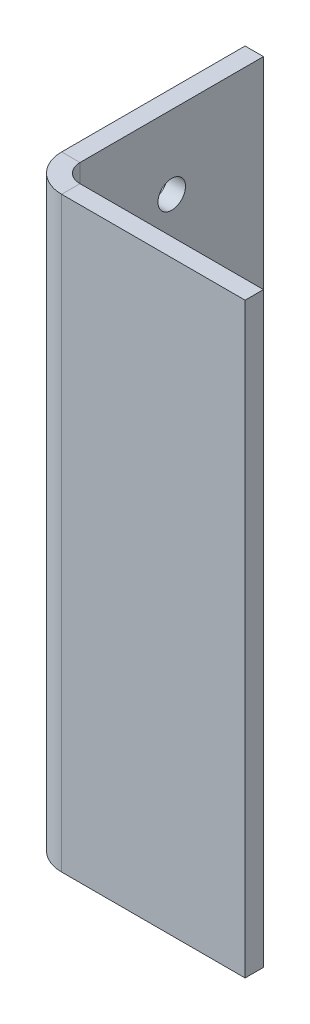
ISO-10303-21;
HEADER;
FILE_DESCRIPTION(('STEP AP214'),'2;1');
FILE_NAME('part.step','',(''),(''),'','','');
FILE_SCHEMA(('AUTOMOTIVE_DESIGN { 1 0 10303 214 1 1 1 1 }'));
ENDSEC;
DATA;
#1=APPLICATION_CONTEXT('core data for automotive mechanical design processes');
#2=APPLICATION_PROTOCOL_DEFINITION('international standard','automotive_design',2000,#1);
#3=PRODUCT_CONTEXT('',#1,'mechanical');
#4=PRODUCT('Part','Part','',(#3));
#5=PRODUCT_RELATED_PRODUCT_CATEGORY('part','',(#4));
#6=PRODUCT_DEFINITION_FORMATION('','',#4);
#7=PRODUCT_DEFINITION_CONTEXT('part definition',#1,'design');
#8=PRODUCT_DEFINITION('design','',#6,#7);
#9=PRODUCT_DEFINITION_SHAPE('','',#8);
#10=(LENGTH_UNIT() NAMED_UNIT(*) SI_UNIT(.MILLI.,.METRE.));
#11=(NAMED_UNIT(*) PLANE_ANGLE_UNIT() SI_UNIT($,.RADIAN.));
#12=(NAMED_UNIT(*) SI_UNIT($,.STERADIAN.) SOLID_ANGLE_UNIT());
#13=UNCERTAINTY_MEASURE_WITH_UNIT(LENGTH_MEASURE(1.E-05),#10,'distance_accuracy_value','');
#14=(GEOMETRIC_REPRESENTATION_CONTEXT(3) GLOBAL_UNCERTAINTY_ASSIGNED_CONTEXT((#13)) GLOBAL_UNIT_ASSIGNED_CONTEXT((#10,
#11,#12)) REPRESENTATION_CONTEXT('',''));
#15=CARTESIAN_POINT('',(0.,0.,0.));
#16=DIRECTION('',(0.,0.,1.));
#17=DIRECTION('',(1.,0.,0.));
#18=AXIS2_PLACEMENT_3D('',#15,#16,#17);
#19=CARTESIAN_POINT('',(0.,101.6,-6.35));
#20=DIRECTION('',(0.,1.,0.));
#21=DIRECTION('',(0.,0.,1.));
#22=AXIS2_PLACEMENT_3D('',#19,#20,#21);
#23=PLANE('',#22);
#24=DIRECTION('',(1.,0.,0.));
#25=VECTOR('',#24,1.);
#26=CARTESIAN_POINT('',(0.,101.6,-6.35));
#27=LINE('',#26,#25);
#28=CARTESIAN_POINT('',(0.,101.6,-6.35));
#29=VERTEX_POINT('',#28);
#30=CARTESIAN_POINT('',(3.175,101.6,-6.35));
#31=VERTEX_POINT('',#30);
#32=EDGE_CURVE('E11',#29,#31,#27,.T.);
#33=ORIENTED_EDGE('',*,*,#32,.F.);
#34=CARTESIAN_POINT('',(6.35,101.6,-6.35));
#35=DIRECTION('',(0.,-1.,0.));
#36=DIRECTION('',(0.,0.,-1.));
#37=AXIS2_PLACEMENT_3D('',#34,#35,#36);
#38=CIRCLE('',#37,6.35);
#39=CARTESIAN_POINT('',(6.35,101.6,0.));
#40=VERTEX_POINT('',#39);
#41=EDGE_CURVE('E128',#29,#40,#38,.F.);
#42=ORIENTED_EDGE('',*,*,#41,.T.);
#43=DIRECTION('',(0.,0.,1.));
#44=VECTOR('',#43,1.);
#45=CARTESIAN_POINT('',(6.35,101.6,-3.175));
#46=LINE('',#45,#44);
#47=CARTESIAN_POINT('',(6.35,101.6,-3.175));
#48=VERTEX_POINT('',#47);
#49=EDGE_CURVE('E46',#48,#40,#46,.T.);
#50=ORIENTED_EDGE('',*,*,#49,.F.);
#51=CARTESIAN_POINT('',(6.35,101.6,-6.35));
#52=DIRECTION('',(0.,1.,0.));
#53=DIRECTION('',(1.,0.,0.));
#54=AXIS2_PLACEMENT_3D('',#51,#52,#53);
#55=CIRCLE('',#54,3.175);
#56=EDGE_CURVE('E135',#31,#48,#55,.T.);
#57=ORIENTED_EDGE('',*,*,#56,.F.);
#58=EDGE_LOOP('',(#33,#42,#50,#57));
#59=FACE_BOUND('',#58,.T.);
#60=ADVANCED_FACE('F38',(#59),#23,.T.);
#61=CARTESIAN_POINT('',(6.35,101.6,-3.175));
#62=DIRECTION('',(0.,1.,0.));
#63=DIRECTION('',(0.,0.,1.));
#64=AXIS2_PLACEMENT_3D('',#61,#62,#63);
#65=PLANE('',#64);
#66=DIRECTION('',(0.,0.,1.));
#67=VECTOR('',#66,1.);
#68=CARTESIAN_POINT('',(0.,101.6,0.));
#69=LINE('',#68,#67);
#70=CARTESIAN_POINT('',(0.,101.6,-38.1));
#71=VERTEX_POINT('',#70);
#72=EDGE_CURVE('E123',#71,#29,#69,.T.);
#73=ORIENTED_EDGE('',*,*,#72,.T.);
#74=ORIENTED_EDGE('',*,*,#32,.T.);
#75=DIRECTION('',(0.,0.,-1.));
#76=VECTOR('',#75,1.);
#77=CARTESIAN_POINT('',(3.175,101.6,0.));
#78=LINE('',#77,#76);
#79=CARTESIAN_POINT('',(3.175,101.6,-38.1));
#80=VERTEX_POINT('',#79);
#81=EDGE_CURVE('E133',#80,#31,#78,.F.);
#82=ORIENTED_EDGE('',*,*,#81,.F.);
#83=DIRECTION('',(1.,0.,0.));
#84=VECTOR('',#83,1.);
#85=CARTESIAN_POINT('',(0.,101.6,-38.1));
#86=LINE('',#85,#84);
#87=EDGE_CURVE('E114',#71,#80,#86,.T.);
#88=ORIENTED_EDGE('',*,*,#87,.F.);
#89=EDGE_LOOP('',(#73,#74,#82,#88));
#90=FACE_BOUND('',#89,.T.);
#91=ADVANCED_FACE('F131',(#90),#65,.T.);
#92=CARTESIAN_POINT('',(6.35,0.,0.));
#93=DIRECTION('',(0.,-1.,0.));
#94=DIRECTION('',(0.,0.,-1.));
#95=AXIS2_PLACEMENT_3D('',#92,#93,#94);
#96=PLANE('',#95);
#97=DIRECTION('',(0.,0.,-1.));
#98=VECTOR('',#97,1.);
#99=CARTESIAN_POINT('',(6.35,0.,0.));
#100=LINE('',#99,#98);
#101=CARTESIAN_POINT('',(6.35,0.,0.));
#102=VERTEX_POINT('',#101);
#103=CARTESIAN_POINT('',(6.35,0.,-3.175));
#104=VERTEX_POINT('',#103);
#105=EDGE_CURVE('E89',#102,#104,#100,.T.);
#106=ORIENTED_EDGE('',*,*,#105,.F.);
#107=CARTESIAN_POINT('',(6.35,0.,-6.35));
#108=DIRECTION('',(0.,-1.,0.));
#109=DIRECTION('',(0.,0.,-1.));
#110=AXIS2_PLACEMENT_3D('',#107,#108,#109);
#111=CIRCLE('',#110,6.35);
#112=CARTESIAN_POINT('',(0.,0.,-6.35));
#113=VERTEX_POINT('',#112);
#114=EDGE_CURVE('E158',#113,#102,#111,.F.);
#115=ORIENTED_EDGE('',*,*,#114,.F.);
#116=DIRECTION('',(-1.,0.,0.));
#117=VECTOR('',#116,1.);
#118=CARTESIAN_POINT('',(3.175,0.,-6.35));
#119=LINE('',#118,#117);
#120=CARTESIAN_POINT('',(3.175,0.,-6.35));
#121=VERTEX_POINT('',#120);
#122=EDGE_CURVE('E82',#121,#113,#119,.T.);
#123=ORIENTED_EDGE('',*,*,#122,.F.);
#124=CARTESIAN_POINT('',(6.35,0.,-6.35));
#125=DIRECTION('',(0.,1.,0.));
#126=DIRECTION('',(1.,0.,0.));
#127=AXIS2_PLACEMENT_3D('',#124,#125,#126);
#128=CIRCLE('',#127,3.175);
#129=EDGE_CURVE('E151',#121,#104,#128,.T.);
#130=ORIENTED_EDGE('',*,*,#129,.T.);
#131=EDGE_LOOP('',(#106,#115,#123,#130));
#132=FACE_BOUND('',#131,.T.);
#133=ADVANCED_FACE('F190',(#132),#96,.T.);
#134=CARTESIAN_POINT('',(3.175,0.,-6.35));
#135=DIRECTION('',(0.,-1.,0.));
#136=DIRECTION('',(0.,0.,-1.));
#137=AXIS2_PLACEMENT_3D('',#134,#135,#136);
#138=PLANE('',#137);
#139=DIRECTION('',(1.,0.,0.));
#140=VECTOR('',#139,1.);
#141=CARTESIAN_POINT('',(0.,0.,0.));
#142=LINE('',#141,#140);
#143=CARTESIAN_POINT('',(38.1,0.,0.));
#144=VERTEX_POINT('',#143);
#145=EDGE_CURVE('E141',#102,#144,#142,.T.);
#146=ORIENTED_EDGE('',*,*,#145,.F.);
#147=ORIENTED_EDGE('',*,*,#105,.T.);
#148=DIRECTION('',(1.,0.,0.));
#149=VECTOR('',#148,1.);
#150=CARTESIAN_POINT('',(0.,0.,-3.175));
#151=LINE('',#150,#149);
#152=CARTESIAN_POINT('',(38.1,0.,-3.175));
#153=VERTEX_POINT('',#152);
#154=EDGE_CURVE('E148',#104,#153,#151,.T.);
#155=ORIENTED_EDGE('',*,*,#154,.T.);
#156=DIRECTION('',(0.,0.,1.));
#157=VECTOR('',#156,1.);
#158=CARTESIAN_POINT('',(38.1,0.,-3.175));
#159=LINE('',#158,#157);
#160=EDGE_CURVE('E144',#153,#144,#159,.T.);
#161=ORIENTED_EDGE('',*,*,#160,.T.);
#162=EDGE_LOOP('',(#146,#147,#155,#161));
#163=FACE_BOUND('',#162,.T.);
#164=ADVANCED_FACE('F177',(#163),#138,.T.);
#165=CARTESIAN_POINT('',(0.,101.6,0.));
#166=DIRECTION('',(0.,0.,-1.));
#167=DIRECTION('',(-1.,0.,0.));
#168=AXIS2_PLACEMENT_3D('',#165,#166,#167);
#169=PLANE('',#168);
#170=ORIENTED_EDGE('',*,*,#145,.T.);
#171=DIRECTION('',(0.,-1.,0.));
#172=VECTOR('',#171,1.);
#173=CARTESIAN_POINT('',(38.1,101.6,0.));
#174=LINE('',#173,#172);
#175=CARTESIAN_POINT('',(38.1,101.6,0.));
#176=VERTEX_POINT('',#175);
#177=EDGE_CURVE('E172',#176,#144,#174,.T.);
#178=ORIENTED_EDGE('',*,*,#177,.F.);
#179=DIRECTION('',(1.,0.,0.));
#180=VECTOR('',#179,1.);
#181=CARTESIAN_POINT('',(0.,101.6,0.));
#182=LINE('',#181,#180);
#183=EDGE_CURVE('E95',#40,#176,#182,.T.);
#184=ORIENTED_EDGE('',*,*,#183,.F.);
#185=DIRECTION('',(0.,-1.,0.));
#186=VECTOR('',#185,1.);
#187=CARTESIAN_POINT('',(6.35,101.6,0.));
#188=LINE('',#187,#186);
#189=EDGE_CURVE('E140',#40,#102,#188,.T.);
#190=ORIENTED_EDGE('',*,*,#189,.T.);
#191=EDGE_LOOP('',(#170,#178,#184,#190));
#192=FACE_BOUND('',#191,.T.);
#193=ADVANCED_FACE('F262',(#192),#169,.F.);
#194=CARTESIAN_POINT('',(38.1,101.6,-3.175));
#195=DIRECTION('',(1.,0.,0.));
#196=DIRECTION('',(0.,0.,-1.));
#197=AXIS2_PLACEMENT_3D('',#194,#195,#196);
#198=PLANE('',#197);
#199=ORIENTED_EDGE('',*,*,#160,.F.);
#200=DIRECTION('',(0.,-1.,0.));
#201=VECTOR('',#200,1.);
#202=CARTESIAN_POINT('',(38.1,101.6,-3.175));
#203=LINE('',#202,#201);
#204=CARTESIAN_POINT('',(38.1,101.6,-3.175));
#205=VERTEX_POINT('',#204);
#206=EDGE_CURVE('E170',#205,#153,#203,.T.);
#207=ORIENTED_EDGE('',*,*,#206,.F.);
#208=DIRECTION('',(0.,0.,1.));
#209=VECTOR('',#208,1.);
#210=CARTESIAN_POINT('',(38.1,101.6,-3.175));
#211=LINE('',#210,#209);
#212=EDGE_CURVE('E196',#205,#176,#211,.T.);
#213=ORIENTED_EDGE('',*,*,#212,.T.);
#214=ORIENTED_EDGE('',*,*,#177,.T.);
#215=EDGE_LOOP('',(#199,#207,#213,#214));
#216=FACE_BOUND('',#215,.T.);
#217=ADVANCED_FACE('F265',(#216),#198,.T.);
#218=CARTESIAN_POINT('',(0.,101.6,-3.175));
#219=DIRECTION('',(0.,0.,-1.));
#220=DIRECTION('',(-1.,0.,0.));
#221=AXIS2_PLACEMENT_3D('',#218,#219,#220);
#222=PLANE('',#221);
#223=ORIENTED_EDGE('',*,*,#154,.F.);
#224=DIRECTION('',(0.,-1.,0.));
#225=VECTOR('',#224,1.);
#226=CARTESIAN_POINT('',(6.35,101.6,-3.175));
#227=LINE('',#226,#225);
#228=EDGE_CURVE('E167',#48,#104,#227,.T.);
#229=ORIENTED_EDGE('',*,*,#228,.F.);
#230=DIRECTION('',(1.,0.,0.));
#231=VECTOR('',#230,1.);
#232=CARTESIAN_POINT('',(0.,101.6,-3.175));
#233=LINE('',#232,#231);
#234=EDGE_CURVE('E195',#48,#205,#233,.T.);
#235=ORIENTED_EDGE('',*,*,#234,.T.);
#236=ORIENTED_EDGE('',*,*,#206,.T.);
#237=EDGE_LOOP('',(#223,#229,#235,#236));
#238=FACE_BOUND('',#237,.T.);
#239=ADVANCED_FACE('F188',(#238),#222,.T.);
#240=CARTESIAN_POINT('',(6.35,101.6,-6.35));
#241=DIRECTION('',(0.,-1.,0.));
#242=DIRECTION('',(0.,0.,-1.));
#243=AXIS2_PLACEMENT_3D('',#240,#241,#242);
#244=CYLINDRICAL_SURFACE('',#243,3.175);
#245=ORIENTED_EDGE('',*,*,#129,.F.);
#246=DIRECTION('',(0.,-1.,0.));
#247=VECTOR('',#246,1.);
#248=CARTESIAN_POINT('',(3.175,101.6,-6.35));
#249=LINE('',#248,#247);
#250=EDGE_CURVE('E164',#31,#121,#249,.T.);
#251=ORIENTED_EDGE('',*,*,#250,.F.);
#252=ORIENTED_EDGE('',*,*,#56,.T.);
#253=ORIENTED_EDGE('',*,*,#228,.T.);
#254=EDGE_LOOP('',(#245,#251,#252,#253));
#255=FACE_BOUND('',#254,.T.);
#256=ADVANCED_FACE('F183',(#255),#244,.F.);
#257=CARTESIAN_POINT('',(3.175,101.6,0.));
#258=DIRECTION('',(1.,0.,0.));
#259=DIRECTION('',(0.,0.,-1.));
#260=AXIS2_PLACEMENT_3D('',#257,#258,#259);
#261=PLANE('',#260);
#262=CARTESIAN_POINT('',(3.175,12.7,-22.225));
#263=DIRECTION('',(1.,0.,0.));
#264=DIRECTION('',(0.,0.,-1.));
#265=AXIS2_PLACEMENT_3D('',#262,#263,#264);
#266=CIRCLE('',#265,2.38125);
#267=CARTESIAN_POINT('',(3.175,12.7,-24.60625));
#268=VERTEX_POINT('',#267);
#269=EDGE_CURVE('E214',#268,#268,#266,.T.);
#270=ORIENTED_EDGE('',*,*,#269,.F.);
#271=EDGE_LOOP('',(#270));
#272=FACE_BOUND('',#271,.T.);
#273=CARTESIAN_POINT('',(3.175,50.8,-22.225));
#274=DIRECTION('',(1.,0.,0.));
#275=DIRECTION('',(0.,0.,-1.));
#276=AXIS2_PLACEMENT_3D('',#273,#274,#275);
#277=CIRCLE('',#276,2.38125);
#278=CARTESIAN_POINT('',(3.175,50.8,-24.60625));
#279=VERTEX_POINT('',#278);
#280=EDGE_CURVE('E208',#279,#279,#277,.T.);
#281=ORIENTED_EDGE('',*,*,#280,.F.);
#282=EDGE_LOOP('',(#281));
#283=FACE_BOUND('',#282,.T.);
#284=CARTESIAN_POINT('',(3.175,88.9,-22.225));
#285=DIRECTION('',(1.,0.,0.));
#286=DIRECTION('',(0.,0.,-1.));
#287=AXIS2_PLACEMENT_3D('',#284,#285,#286);
#288=CIRCLE('',#287,2.38125);
#289=CARTESIAN_POINT('',(3.175,88.9,-24.60625));
#290=VERTEX_POINT('',#289);
#291=EDGE_CURVE('E202',#290,#290,#288,.T.);
#292=ORIENTED_EDGE('',*,*,#291,.F.);
#293=EDGE_LOOP('',(#292));
#294=FACE_BOUND('',#293,.T.);
#295=DIRECTION('',(0.,0.,-1.));
#296=VECTOR('',#295,1.);
#297=CARTESIAN_POINT('',(3.175,0.,0.));
#298=LINE('',#297,#296);
#299=CARTESIAN_POINT('',(3.175,0.,-38.1));
#300=VERTEX_POINT('',#299);
#301=EDGE_CURVE('E153',#300,#121,#298,.F.);
#302=ORIENTED_EDGE('',*,*,#301,.F.);
#303=DIRECTION('',(0.,-1.,0.));
#304=VECTOR('',#303,1.);
#305=CARTESIAN_POINT('',(3.175,101.6,-38.1));
#306=LINE('',#305,#304);
#307=EDGE_CURVE('E118',#80,#300,#306,.T.);
#308=ORIENTED_EDGE('',*,*,#307,.F.);
#309=ORIENTED_EDGE('',*,*,#81,.T.);
#310=ORIENTED_EDGE('',*,*,#250,.T.);
#311=EDGE_LOOP('',(#302,#308,#309,#310));
#312=FACE_BOUND('',#311,.T.);
#313=ADVANCED_FACE('F193',(#272,#283,#294,#312),#261,.T.);
#314=CARTESIAN_POINT('',(0.,101.6,-38.1));
#315=DIRECTION('',(0.,0.,-1.));
#316=DIRECTION('',(-1.,0.,0.));
#317=AXIS2_PLACEMENT_3D('',#314,#315,#316);
#318=PLANE('',#317);
#319=DIRECTION('',(1.,0.,0.));
#320=VECTOR('',#319,1.);
#321=CARTESIAN_POINT('',(0.,0.,-38.1));
#322=LINE('',#321,#320);
#323=CARTESIAN_POINT('',(0.,0.,-38.1));
#324=VERTEX_POINT('',#323);
#325=EDGE_CURVE('E116',#324,#300,#322,.T.);
#326=ORIENTED_EDGE('',*,*,#325,.F.);
#327=DIRECTION('',(0.,-1.,0.));
#328=VECTOR('',#327,1.);
#329=CARTESIAN_POINT('',(0.,101.6,-38.1));
#330=LINE('',#329,#328);
#331=EDGE_CURVE('E110',#71,#324,#330,.T.);
#332=ORIENTED_EDGE('',*,*,#331,.F.);
#333=ORIENTED_EDGE('',*,*,#87,.T.);
#334=ORIENTED_EDGE('',*,*,#307,.T.);
#335=EDGE_LOOP('',(#326,#332,#333,#334));
#336=FACE_BOUND('',#335,.T.);
#337=ADVANCED_FACE('F112',(#336),#318,.T.);
#338=CARTESIAN_POINT('',(0.,101.6,0.));
#339=DIRECTION('',(1.,0.,0.));
#340=DIRECTION('',(0.,0.,-1.));
#341=AXIS2_PLACEMENT_3D('',#338,#339,#340);
#342=PLANE('',#341);
#343=CARTESIAN_POINT('',(0.,12.7,-22.225));
#344=DIRECTION('',(1.,0.,0.));
#345=DIRECTION('',(0.,0.,-1.));
#346=AXIS2_PLACEMENT_3D('',#343,#344,#345);
#347=CIRCLE('',#346,2.38125);
#348=CARTESIAN_POINT('',(0.,12.7,-24.60625));
#349=VERTEX_POINT('',#348);
#350=EDGE_CURVE('E205',#349,#349,#347,.T.);
#351=ORIENTED_EDGE('',*,*,#350,.T.);
#352=EDGE_LOOP('',(#351));
#353=FACE_BOUND('',#352,.T.);
#354=CARTESIAN_POINT('',(0.,50.8,-22.225));
#355=DIRECTION('',(1.,0.,0.));
#356=DIRECTION('',(0.,0.,-1.));
#357=AXIS2_PLACEMENT_3D('',#354,#355,#356);
#358=CIRCLE('',#357,2.38125);
#359=CARTESIAN_POINT('',(0.,50.8,-24.60625));
#360=VERTEX_POINT('',#359);
#361=EDGE_CURVE('E211',#360,#360,#358,.T.);
#362=ORIENTED_EDGE('',*,*,#361,.T.);
#363=EDGE_LOOP('',(#362));
#364=FACE_BOUND('',#363,.T.);
#365=CARTESIAN_POINT('',(0.,88.9,-22.225));
#366=DIRECTION('',(1.,0.,0.));
#367=DIRECTION('',(0.,0.,-1.));
#368=AXIS2_PLACEMENT_3D('',#365,#366,#367);
#369=CIRCLE('',#368,2.38125);
#370=CARTESIAN_POINT('',(0.,88.9,-24.60625));
#371=VERTEX_POINT('',#370);
#372=EDGE_CURVE('E145',#371,#371,#369,.T.);
#373=ORIENTED_EDGE('',*,*,#372,.T.);
#374=EDGE_LOOP('',(#373));
#375=FACE_BOUND('',#374,.T.);
#376=DIRECTION('',(0.,0.,1.));
#377=VECTOR('',#376,1.);
#378=CARTESIAN_POINT('',(0.,0.,0.));
#379=LINE('',#378,#377);
#380=EDGE_CURVE('E156',#324,#113,#379,.T.);
#381=ORIENTED_EDGE('',*,*,#380,.T.);
#382=DIRECTION('',(0.,-1.,0.));
#383=VECTOR('',#382,1.);
#384=CARTESIAN_POINT('',(0.,101.6,-6.35));
#385=LINE('',#384,#383);
#386=EDGE_CURVE('E119',#29,#113,#385,.T.);
#387=ORIENTED_EDGE('',*,*,#386,.F.);
#388=ORIENTED_EDGE('',*,*,#72,.F.);
#389=ORIENTED_EDGE('',*,*,#331,.T.);
#390=EDGE_LOOP('',(#381,#387,#388,#389));
#391=FACE_BOUND('',#390,.T.);
#392=ADVANCED_FACE('F124',(#353,#364,#375,#391),#342,.F.);
#393=CARTESIAN_POINT('',(6.35,101.6,-6.35));
#394=DIRECTION('',(0.,-1.,0.));
#395=DIRECTION('',(0.,0.,-1.));
#396=AXIS2_PLACEMENT_3D('',#393,#394,#395);
#397=CYLINDRICAL_SURFACE('',#396,6.35);
#398=ORIENTED_EDGE('',*,*,#114,.T.);
#399=ORIENTED_EDGE('',*,*,#189,.F.);
#400=ORIENTED_EDGE('',*,*,#41,.F.);
#401=ORIENTED_EDGE('',*,*,#386,.T.);
#402=EDGE_LOOP('',(#398,#399,#400,#401));
#403=FACE_BOUND('',#402,.T.);
#404=ADVANCED_FACE('F278',(#403),#397,.T.);
#405=CARTESIAN_POINT('',(6.35,101.6,-6.35));
#406=DIRECTION('',(0.,1.,0.));
#407=DIRECTION('',(1.,0.,0.));
#408=AXIS2_PLACEMENT_3D('',#405,#406,#407);
#409=PLANE('',#408);
#410=ORIENTED_EDGE('',*,*,#183,.T.);
#411=ORIENTED_EDGE('',*,*,#212,.F.);
#412=ORIENTED_EDGE('',*,*,#234,.F.);
#413=ORIENTED_EDGE('',*,*,#49,.T.);
#414=EDGE_LOOP('',(#410,#411,#412,#413));
#415=FACE_BOUND('',#414,.T.);
#416=ADVANCED_FACE('F247',(#415),#409,.T.);
#417=CARTESIAN_POINT('',(6.35,0.,-6.35));
#418=DIRECTION('',(0.,1.,0.));
#419=DIRECTION('',(1.,0.,0.));
#420=AXIS2_PLACEMENT_3D('',#417,#418,#419);
#421=PLANE('',#420);
#422=ORIENTED_EDGE('',*,*,#301,.T.);
#423=ORIENTED_EDGE('',*,*,#122,.T.);
#424=ORIENTED_EDGE('',*,*,#380,.F.);
#425=ORIENTED_EDGE('',*,*,#325,.T.);
#426=EDGE_LOOP('',(#422,#423,#424,#425));
#427=FACE_BOUND('',#426,.T.);
#428=ADVANCED_FACE('F238',(#427),#421,.F.);
#429=CARTESIAN_POINT('',(0.,88.9,-22.225));
#430=DIRECTION('',(1.,0.,0.));
#431=DIRECTION('',(0.,0.,-1.));
#432=AXIS2_PLACEMENT_3D('',#429,#430,#431);
#433=CYLINDRICAL_SURFACE('',#432,2.38125);
#434=ORIENTED_EDGE('',*,*,#372,.F.);
#435=EDGE_LOOP('',(#434));
#436=FACE_BOUND('',#435,.T.);
#437=ORIENTED_EDGE('',*,*,#291,.T.);
#438=EDGE_LOOP('',(#437));
#439=FACE_BOUND('',#438,.T.);
#440=ADVANCED_FACE('F236',(#436,#439),#433,.F.);
#441=CARTESIAN_POINT('',(0.,50.8,-22.225));
#442=DIRECTION('',(1.,0.,0.));
#443=DIRECTION('',(0.,0.,-1.));
#444=AXIS2_PLACEMENT_3D('',#441,#442,#443);
#445=CYLINDRICAL_SURFACE('',#444,2.38125);
#446=ORIENTED_EDGE('',*,*,#361,.F.);
#447=EDGE_LOOP('',(#446));
#448=FACE_BOUND('',#447,.T.);
#449=ORIENTED_EDGE('',*,*,#280,.T.);
#450=EDGE_LOOP('',(#449));
#451=FACE_BOUND('',#450,.T.);
#452=ADVANCED_FACE('F225',(#448,#451),#445,.F.);
#453=CARTESIAN_POINT('',(0.,12.7,-22.225));
#454=DIRECTION('',(1.,0.,0.));
#455=DIRECTION('',(0.,0.,-1.));
#456=AXIS2_PLACEMENT_3D('',#453,#454,#455);
#457=CYLINDRICAL_SURFACE('',#456,2.38125);
#458=ORIENTED_EDGE('',*,*,#350,.F.);
#459=EDGE_LOOP('',(#458));
#460=FACE_BOUND('',#459,.T.);
#461=ORIENTED_EDGE('',*,*,#269,.T.);
#462=EDGE_LOOP('',(#461));
#463=FACE_BOUND('',#462,.T.);
#464=ADVANCED_FACE('F222',(#460,#463),#457,.F.);
#465=CLOSED_SHELL('',(#60,#91,#133,#164,#193,#217,#239,#256,#313,#337,#392,#404,#416,#428,#440,
#452,#464));
#466=MANIFOLD_SOLID_BREP('B2',#465);
#467=ADVANCED_BREP_SHAPE_REPRESENTATION('',(#18,#466),#14);
#468=SHAPE_DEFINITION_REPRESENTATION(#9,#467);
ENDSEC;
END-ISO-10303-21;
